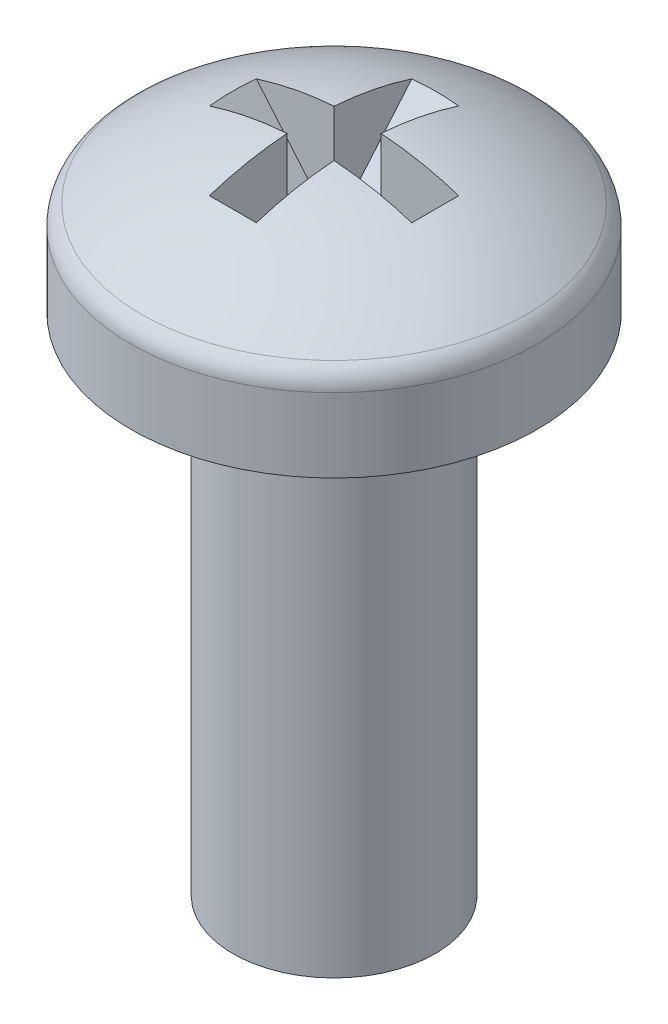
ISO-10303-21;
HEADER;
FILE_DESCRIPTION(('STEP AP214'),'2;1');
FILE_NAME('part.step','',(''),(''),'','','');
FILE_SCHEMA(('AUTOMOTIVE_DESIGN { 1 0 10303 214 1 1 1 1 }'));
ENDSEC;
DATA;
#1=APPLICATION_CONTEXT('core data for automotive mechanical design processes');
#2=APPLICATION_PROTOCOL_DEFINITION('international standard','automotive_design',2000,#1);
#3=PRODUCT_CONTEXT('',#1,'mechanical');
#4=PRODUCT('Part','Part','',(#3));
#5=PRODUCT_RELATED_PRODUCT_CATEGORY('part','',(#4));
#6=PRODUCT_DEFINITION_FORMATION('','',#4);
#7=PRODUCT_DEFINITION_CONTEXT('part definition',#1,'design');
#8=PRODUCT_DEFINITION('design','',#6,#7);
#9=PRODUCT_DEFINITION_SHAPE('','',#8);
#10=(LENGTH_UNIT() NAMED_UNIT(*) SI_UNIT(.MILLI.,.METRE.));
#11=(NAMED_UNIT(*) PLANE_ANGLE_UNIT() SI_UNIT($,.RADIAN.));
#12=(NAMED_UNIT(*) SI_UNIT($,.STERADIAN.) SOLID_ANGLE_UNIT());
#13=UNCERTAINTY_MEASURE_WITH_UNIT(LENGTH_MEASURE(1.E-05),#10,'distance_accuracy_value','');
#14=(GEOMETRIC_REPRESENTATION_CONTEXT(3) GLOBAL_UNCERTAINTY_ASSIGNED_CONTEXT((#13)) GLOBAL_UNIT_ASSIGNED_CONTEXT((#10,
#11,#12)) REPRESENTATION_CONTEXT('',''));
#15=CARTESIAN_POINT('',(0.,0.,0.));
#16=DIRECTION('',(0.,0.,1.));
#17=DIRECTION('',(1.,0.,0.));
#18=AXIS2_PLACEMENT_3D('',#15,#16,#17);
#19=CARTESIAN_POINT('',(0.465,4.65,2.285));
#20=DIRECTION('',(-1.,0.,0.));
#21=DIRECTION('',(0.,0.,1.));
#22=AXIS2_PLACEMENT_3D('',#19,#20,#21);
#23=PLANE('',#22);
#24=DIRECTION('',(0.,0.76333266422502,-0.646005606575619));
#25=VECTOR('',#24,1.);
#26=CARTESIAN_POINT('',(0.465,3.1,-2.285));
#27=LINE('',#26,#25);
#28=CARTESIAN_POINT('',(0.465,0.94945295404814,-0.465));
#29=VERTEX_POINT('',#28);
#30=CARTESIAN_POINT('',(0.465,0.4,0.));
#31=VERTEX_POINT('',#30);
#32=EDGE_CURVE('E255',#29,#31,#27,.F.);
#33=ORIENTED_EDGE('',*,*,#32,.T.);
#34=DIRECTION('',(0.,-0.76333266422502,-0.646005606575619));
#35=VECTOR('',#34,1.);
#36=CARTESIAN_POINT('',(0.465,0.4,0.));
#37=LINE('',#36,#35);
#38=CARTESIAN_POINT('',(0.465,0.94945295404814,0.465));
#39=VERTEX_POINT('',#38);
#40=EDGE_CURVE('E245',#31,#39,#37,.F.);
#41=ORIENTED_EDGE('',*,*,#40,.T.);
#42=DIRECTION('',(0.,0.,1.));
#43=VECTOR('',#42,1.);
#44=CARTESIAN_POINT('',(0.465,0.94945295404814,-0.465));
#45=LINE('',#44,#43);
#46=EDGE_CURVE('E240',#39,#29,#45,.F.);
#47=ORIENTED_EDGE('',*,*,#46,.T.);
#48=EDGE_LOOP('',(#33,#41,#47));
#49=FACE_BOUND('',#48,.T.);
#50=ADVANCED_FACE('F17',(#49),#23,.T.);
#51=CARTESIAN_POINT('',(-2.285,4.65,-0.465));
#52=DIRECTION('',(0.,0.,-1.));
#53=DIRECTION('',(-1.,0.,0.));
#54=AXIS2_PLACEMENT_3D('',#51,#52,#53);
#55=PLANE('',#54);
#56=DIRECTION('',(0.646005606575619,0.76333266422502,0.));
#57=VECTOR('',#56,1.);
#58=CARTESIAN_POINT('',(2.285,3.1,-0.465));
#59=LINE('',#58,#57);
#60=CARTESIAN_POINT('',(2.00334390705982,2.76718973700723,-0.464999999999999));
#61=VERTEX_POINT('',#60);
#62=EDGE_CURVE('E243',#29,#61,#59,.T.);
#63=ORIENTED_EDGE('',*,*,#62,.T.);
#64=CARTESIAN_POINT('',(0.465,3.06675595397475,-0.464999999999998));
#65=CARTESIAN_POINT('',(0.530501324790505,3.06206142493885,-0.464999999999999));
#66=CARTESIAN_POINT('',(0.595931475391858,3.0563742609509,-0.465));
#67=CARTESIAN_POINT('',(0.726411510234753,3.0430395054668,-0.465));
#68=CARTESIAN_POINT('',(0.791461944850671,3.035397299066,-0.465));
#69=CARTESIAN_POINT('',(0.921184381433152,3.01816728890247,-0.465));
#70=CARTESIAN_POINT('',(0.985856856175131,3.00858304450111,-0.465));
#71=CARTESIAN_POINT('',(1.11482464756555,2.98747885600111,-0.465));
#72=CARTESIAN_POINT('',(1.17912025433069,2.97596068477606,-0.465));
#73=CARTESIAN_POINT('',(1.30733536800959,2.95099297996924,-0.465));
#74=CARTESIAN_POINT('',(1.37125487492336,2.93754344638746,-0.465));
#75=CARTESIAN_POINT('',(1.498717934945,2.90871210374989,-0.465));
#76=CARTESIAN_POINT('',(1.56226109172352,2.89332854250361,-0.465));
#77=CARTESIAN_POINT('',(1.68896992101965,2.86062294081929,-0.465));
#78=CARTESIAN_POINT('',(1.75213469616409,2.84329742370304,-0.465));
#79=CARTESIAN_POINT('',(1.8780841234055,2.80669691859744,-0.465));
#80=CARTESIAN_POINT('',(1.9408672649759,2.78741673248598,-0.464999999999999));
#81=CARTESIAN_POINT('',(2.00334390705982,2.76718973700723,-0.464999999999996));
#82=B_SPLINE_CURVE_WITH_KNOTS('',3,(#64,#65,#66,#67,#68,#69,#70,#71,#72,#73,#74,#75,#76,#77,#78,
#79,#80,#81),.UNSPECIFIED.,.F.,.F.,(4,2,2,2,2,2,2,2,4),(0.,0.197000433773616,0.393463972151465,
0.589570637798733,0.7854984999692,0.981426362139666,1.17753302778693,1.37399656616478,
1.5709969999384),.UNSPECIFIED.);
#83=CARTESIAN_POINT('',(0.464999999999999,3.06675595397475,-0.464999999999999));
#84=VERTEX_POINT('',#83);
#85=EDGE_CURVE('E20',#84,#61,#82,.T.);
#86=ORIENTED_EDGE('',*,*,#85,.F.);
#87=DIRECTION('',(0.,1.,0.));
#88=VECTOR('',#87,1.);
#89=CARTESIAN_POINT('',(0.465,4.65,-0.465));
#90=LINE('',#89,#88);
#91=EDGE_CURVE('E237',#29,#84,#90,.T.);
#92=ORIENTED_EDGE('',*,*,#91,.F.);
#93=EDGE_LOOP('',(#63,#86,#92));
#94=FACE_BOUND('',#93,.T.);
#95=ADVANCED_FACE('F568',(#94),#55,.F.);
#96=CARTESIAN_POINT('',(-0.465,3.1,-2.285));
#97=DIRECTION('',(0.,-0.646005606575619,-0.76333266422502));
#98=DIRECTION('',(0.,0.76333266422502,-0.646005606575619));
#99=AXIS2_PLACEMENT_3D('',#96,#97,#98);
#100=PLANE('',#99);
#101=ORIENTED_EDGE('',*,*,#32,.F.);
#102=DIRECTION('',(-0.542627540849774,-0.641179151113519,0.542627540849775));
#103=VECTOR('',#102,1.);
#104=CARTESIAN_POINT('',(0.465,0.94945295404814,-0.465));
#105=LINE('',#104,#103);
#106=CARTESIAN_POINT('',(0.,0.4,0.));
#107=VERTEX_POINT('',#106);
#108=EDGE_CURVE('E230',#29,#107,#105,.T.);
#109=ORIENTED_EDGE('',*,*,#108,.T.);
#110=DIRECTION('',(1.,0.,0.));
#111=VECTOR('',#110,1.);
#112=CARTESIAN_POINT('',(-0.465,0.4,0.));
#113=LINE('',#112,#111);
#114=EDGE_CURVE('E252',#107,#31,#113,.T.);
#115=ORIENTED_EDGE('',*,*,#114,.T.);
#116=EDGE_LOOP('',(#101,#109,#115));
#117=FACE_BOUND('',#116,.T.);
#118=ADVANCED_FACE('F561',(#117),#100,.F.);
#119=CARTESIAN_POINT('',(-0.465,0.4,0.));
#120=DIRECTION('',(0.,-0.646005606575619,0.76333266422502));
#121=DIRECTION('',(0.,-0.76333266422502,-0.646005606575619));
#122=AXIS2_PLACEMENT_3D('',#119,#120,#121);
#123=PLANE('',#122);
#124=ORIENTED_EDGE('',*,*,#114,.F.);
#125=DIRECTION('',(0.542627540849774,0.641179151113519,0.542627540849775));
#126=VECTOR('',#125,1.);
#127=CARTESIAN_POINT('',(0.,0.400000000000001,0.));
#128=LINE('',#127,#126);
#129=EDGE_CURVE('E221',#107,#39,#128,.T.);
#130=ORIENTED_EDGE('',*,*,#129,.T.);
#131=ORIENTED_EDGE('',*,*,#40,.F.);
#132=EDGE_LOOP('',(#124,#130,#131));
#133=FACE_BOUND('',#132,.T.);
#134=ADVANCED_FACE('F368',(#133),#123,.F.);
#135=CARTESIAN_POINT('',(2.285,3.1,-0.465));
#136=DIRECTION('',(0.76333266422502,-0.646005606575619,0.));
#137=DIRECTION('',(0.646005606575619,0.76333266422502,0.));
#138=AXIS2_PLACEMENT_3D('',#135,#136,#137);
#139=PLANE('',#138);
#140=DIRECTION('',(-0.646005606575619,-0.76333266422502,0.));
#141=VECTOR('',#140,1.);
#142=CARTESIAN_POINT('',(2.00334390705982,2.76718973700723,0.465));
#143=LINE('',#142,#141);
#144=CARTESIAN_POINT('',(2.00334390705982,2.76718973700723,0.465));
#145=VERTEX_POINT('',#144);
#146=EDGE_CURVE('E218',#145,#39,#143,.T.);
#147=ORIENTED_EDGE('',*,*,#146,.F.);
#148=CARTESIAN_POINT('',(2.00334390705982,2.76718973700723,-0.465000000000004));
#149=CARTESIAN_POINT('',(2.01106975790789,2.77631875113877,-0.310000000000004));
#150=CARTESIAN_POINT('',(2.01493268333202,2.78088325820448,-0.155000000000003));
#151=CARTESIAN_POINT('',(2.01493268333242,2.78088325820427,0.155000000000005));
#152=CARTESIAN_POINT('',(2.01106975790868,2.77631875113834,0.310000000000011));
#153=CARTESIAN_POINT('',(2.00334390706101,2.76718973700658,0.465000000000019));
#154=B_SPLINE_CURVE_WITH_KNOTS('',3,(#148,#149,#150,#151,#152,#153),.UNSPECIFIED.,.F.,.F.,(4,2,
4),(0.,0.465345906029345,0.930691812058695),.UNSPECIFIED.);
#155=EDGE_CURVE('E86',#61,#145,#154,.T.);
#156=ORIENTED_EDGE('',*,*,#155,.F.);
#157=ORIENTED_EDGE('',*,*,#62,.F.);
#158=ORIENTED_EDGE('',*,*,#46,.F.);
#159=EDGE_LOOP('',(#147,#156,#157,#158));
#160=FACE_BOUND('',#159,.T.);
#161=ADVANCED_FACE('F363',(#160),#139,.F.);
#162=CARTESIAN_POINT('',(0.465,4.65,2.285));
#163=DIRECTION('',(-1.,0.,0.));
#164=DIRECTION('',(0.,0.,1.));
#165=AXIS2_PLACEMENT_3D('',#162,#163,#164);
#166=PLANE('',#165);
#167=ORIENTED_EDGE('',*,*,#91,.T.);
#168=CARTESIAN_POINT('',(0.464999999999999,-3.42079422382671,0.));
#169=DIRECTION('',(1.,0.,0.));
#170=DIRECTION('',(0.,0.,-1.));
#171=AXIS2_PLACEMENT_3D('',#168,#169,#170);
#172=CIRCLE('',#171,6.50419344034999);
#173=CARTESIAN_POINT('',(0.464999999999999,2.76718973700723,-2.00334390705982));
#174=VERTEX_POINT('',#173);
#175=EDGE_CURVE('E234',#84,#174,#172,.F.);
#176=ORIENTED_EDGE('',*,*,#175,.T.);
#177=DIRECTION('',(0.,0.76333266422502,-0.646005606575619));
#178=VECTOR('',#177,1.);
#179=CARTESIAN_POINT('',(0.465,3.1,-2.285));
#180=LINE('',#179,#178);
#181=EDGE_CURVE('E209',#174,#29,#180,.F.);
#182=ORIENTED_EDGE('',*,*,#181,.T.);
#183=EDGE_LOOP('',(#167,#176,#182));
#184=FACE_BOUND('',#183,.T.);
#185=ADVANCED_FACE('F359',(#184),#166,.T.);
#186=CARTESIAN_POINT('',(2.285,3.1,-0.465));
#187=DIRECTION('',(0.76333266422502,-0.646005606575619,0.));
#188=DIRECTION('',(0.646005606575619,0.76333266422502,0.));
#189=AXIS2_PLACEMENT_3D('',#186,#187,#188);
#190=PLANE('',#189);
#191=ORIENTED_EDGE('',*,*,#108,.F.);
#192=DIRECTION('',(-0.646005606575619,-0.76333266422502,0.));
#193=VECTOR('',#192,1.);
#194=CARTESIAN_POINT('',(0.465,0.94945295404814,-0.465));
#195=LINE('',#194,#193);
#196=CARTESIAN_POINT('',(0.,0.4,-0.465));
#197=VERTEX_POINT('',#196);
#198=EDGE_CURVE('E226',#29,#197,#195,.T.);
#199=ORIENTED_EDGE('',*,*,#198,.T.);
#200=DIRECTION('',(0.,0.,1.));
#201=VECTOR('',#200,1.);
#202=CARTESIAN_POINT('',(0.,0.4,-0.465));
#203=LINE('',#202,#201);
#204=EDGE_CURVE('E201',#197,#107,#203,.T.);
#205=ORIENTED_EDGE('',*,*,#204,.T.);
#206=EDGE_LOOP('',(#191,#199,#205));
#207=FACE_BOUND('',#206,.T.);
#208=ADVANCED_FACE('F355',(#207),#190,.F.);
#209=CARTESIAN_POINT('',(-2.285,4.65,-0.465));
#210=DIRECTION('',(0.,0.,-1.));
#211=DIRECTION('',(-1.,0.,0.));
#212=AXIS2_PLACEMENT_3D('',#209,#210,#211);
#213=PLANE('',#212);
#214=DIRECTION('',(1.,0.,0.));
#215=VECTOR('',#214,1.);
#216=CARTESIAN_POINT('',(-0.465,0.94945295404814,-0.465));
#217=LINE('',#216,#215);
#218=CARTESIAN_POINT('',(-0.465,0.94945295404814,-0.465));
#219=VERTEX_POINT('',#218);
#220=EDGE_CURVE('E93',#29,#219,#217,.F.);
#221=ORIENTED_EDGE('',*,*,#220,.T.);
#222=DIRECTION('',(0.646005606575619,-0.76333266422502,0.));
#223=VECTOR('',#222,1.);
#224=CARTESIAN_POINT('',(0.,0.4,-0.465));
#225=LINE('',#224,#223);
#226=EDGE_CURVE('E196',#219,#197,#225,.T.);
#227=ORIENTED_EDGE('',*,*,#226,.T.);
#228=ORIENTED_EDGE('',*,*,#198,.F.);
#229=EDGE_LOOP('',(#221,#227,#228));
#230=FACE_BOUND('',#229,.T.);
#231=ADVANCED_FACE('F351',(#230),#213,.F.);
#232=CARTESIAN_POINT('',(2.285,3.1,-0.465));
#233=DIRECTION('',(0.76333266422502,-0.646005606575619,0.));
#234=DIRECTION('',(0.646005606575619,0.76333266422502,0.));
#235=AXIS2_PLACEMENT_3D('',#232,#233,#234);
#236=PLANE('',#235);
#237=ORIENTED_EDGE('',*,*,#129,.F.);
#238=DIRECTION('',(0.,0.,1.));
#239=VECTOR('',#238,1.);
#240=CARTESIAN_POINT('',(0.,0.4,-0.465));
#241=LINE('',#240,#239);
#242=CARTESIAN_POINT('',(0.,0.4,0.465));
#243=VERTEX_POINT('',#242);
#244=EDGE_CURVE('E192',#107,#243,#241,.T.);
#245=ORIENTED_EDGE('',*,*,#244,.T.);
#246=DIRECTION('',(-0.646005606575619,-0.76333266422502,0.));
#247=VECTOR('',#246,1.);
#248=CARTESIAN_POINT('',(0.465,0.94945295404814,0.465));
#249=LINE('',#248,#247);
#250=EDGE_CURVE('E187',#39,#243,#249,.T.);
#251=ORIENTED_EDGE('',*,*,#250,.F.);
#252=EDGE_LOOP('',(#237,#245,#251));
#253=FACE_BOUND('',#252,.T.);
#254=ADVANCED_FACE('F347',(#253),#236,.F.);
#255=CARTESIAN_POINT('',(-2.285,4.65,0.465));
#256=DIRECTION('',(0.,0.,-1.));
#257=DIRECTION('',(-1.,0.,0.));
#258=AXIS2_PLACEMENT_3D('',#255,#256,#257);
#259=PLANE('',#258);
#260=DIRECTION('',(0.,1.,0.));
#261=VECTOR('',#260,1.);
#262=CARTESIAN_POINT('',(0.465,4.65,0.465));
#263=LINE('',#262,#261);
#264=CARTESIAN_POINT('',(0.464999999999999,3.06675595397475,0.465));
#265=VERTEX_POINT('',#264);
#266=EDGE_CURVE('E179',#265,#39,#263,.F.);
#267=ORIENTED_EDGE('',*,*,#266,.F.);
#268=CARTESIAN_POINT('',(0.465,3.06675595397475,0.465));
#269=CARTESIAN_POINT('',(0.530501324790505,3.06206142493885,0.465));
#270=CARTESIAN_POINT('',(0.595931475391859,3.0563742609509,0.465));
#271=CARTESIAN_POINT('',(0.726411510234753,3.0430395054668,0.465));
#272=CARTESIAN_POINT('',(0.791461944850671,3.035397299066,0.465));
#273=CARTESIAN_POINT('',(0.921184381433152,3.01816728890247,0.465));
#274=CARTESIAN_POINT('',(0.985856856175132,3.00858304450111,0.465));
#275=CARTESIAN_POINT('',(1.11482464756555,2.98747885600111,0.465));
#276=CARTESIAN_POINT('',(1.17912025433069,2.97596068477606,0.465));
#277=CARTESIAN_POINT('',(1.30733536800959,2.95099297996924,0.465));
#278=CARTESIAN_POINT('',(1.37125487492336,2.93754344638746,0.465));
#279=CARTESIAN_POINT('',(1.498717934945,2.90871210374989,0.465));
#280=CARTESIAN_POINT('',(1.56226109172352,2.89332854250361,0.465));
#281=CARTESIAN_POINT('',(1.68896992101965,2.86062294081929,0.465));
#282=CARTESIAN_POINT('',(1.75213469616409,2.84329742370304,0.465));
#283=CARTESIAN_POINT('',(1.8780841234055,2.80669691859744,0.465));
#284=CARTESIAN_POINT('',(1.9408672649759,2.78741673248598,0.465));
#285=CARTESIAN_POINT('',(2.00334390705982,2.76718973700723,0.465));
#286=B_SPLINE_CURVE_WITH_KNOTS('',3,(#268,#269,#270,#271,#272,#273,#274,#275,#276,#277,#278,
#279,#280,#281,#282,#283,#284,#285),.UNSPECIFIED.,.F.,.F.,(4,2,2,2,2,2,2,2,4),(0.,
0.197000433773616,0.393463972151465,0.589570637798734,0.7854984999692,0.981426362139666,
1.17753302778693,1.37399656616478,1.5709969999384),.UNSPECIFIED.);
#287=EDGE_CURVE('E212',#265,#145,#286,.T.);
#288=ORIENTED_EDGE('',*,*,#287,.T.);
#289=ORIENTED_EDGE('',*,*,#146,.T.);
#290=EDGE_LOOP('',(#267,#288,#289));
#291=FACE_BOUND('',#290,.T.);
#292=ADVANCED_FACE('F342',(#291),#259,.T.);
#293=CARTESIAN_POINT('',(-0.465,3.1,-2.285));
#294=DIRECTION('',(0.,-0.646005606575619,-0.76333266422502));
#295=DIRECTION('',(0.,0.76333266422502,-0.646005606575619));
#296=AXIS2_PLACEMENT_3D('',#293,#294,#295);
#297=PLANE('',#296);
#298=DIRECTION('',(0.,-0.76333266422502,0.646005606575619));
#299=VECTOR('',#298,1.);
#300=CARTESIAN_POINT('',(-0.465,2.76718973700723,-2.00334390705982));
#301=LINE('',#300,#299);
#302=CARTESIAN_POINT('',(-0.465,2.76718973700723,-2.00334390705982));
#303=VERTEX_POINT('',#302);
#304=EDGE_CURVE('E174',#303,#219,#301,.T.);
#305=ORIENTED_EDGE('',*,*,#304,.T.);
#306=ORIENTED_EDGE('',*,*,#220,.F.);
#307=ORIENTED_EDGE('',*,*,#181,.F.);
#308=CARTESIAN_POINT('',(-0.465,2.76718973700723,-2.00334390705982));
#309=CARTESIAN_POINT('',(-0.31,2.77631875113875,-2.01106975790816));
#310=CARTESIAN_POINT('',(-0.155,2.78088325820451,-2.01493268333233));
#311=CARTESIAN_POINT('',(0.155,2.78088325820451,-2.01493268333233));
#312=CARTESIAN_POINT('',(0.31,2.77631875113875,-2.01106975790816));
#313=CARTESIAN_POINT('',(0.465,2.76718973700723,-2.00334390705982));
#314=B_SPLINE_CURVE_WITH_KNOTS('',3,(#308,#309,#310,#311,#312,#313),.UNSPECIFIED.,.F.,.F.,(4,2,
4),(0.,0.465345906029348,0.930691812058696),.UNSPECIFIED.);
#315=EDGE_CURVE('E206',#303,#174,#314,.T.);
#316=ORIENTED_EDGE('',*,*,#315,.F.);
#317=EDGE_LOOP('',(#305,#306,#307,#316));
#318=FACE_BOUND('',#317,.T.);
#319=ADVANCED_FACE('F337',(#318),#297,.F.);
#320=CARTESIAN_POINT('',(0.,0.4,-0.465));
#321=DIRECTION('',(-0.76333266422502,-0.646005606575619,0.));
#322=DIRECTION('',(0.646005606575619,-0.76333266422502,0.));
#323=AXIS2_PLACEMENT_3D('',#320,#321,#322);
#324=PLANE('',#323);
#325=DIRECTION('',(0.542627540849775,-0.641179151113519,0.542627540849774));
#326=VECTOR('',#325,1.);
#327=CARTESIAN_POINT('',(-0.465,0.949452954048141,-0.465));
#328=LINE('',#327,#326);
#329=EDGE_CURVE('E120',#219,#107,#328,.T.);
#330=ORIENTED_EDGE('',*,*,#329,.T.);
#331=ORIENTED_EDGE('',*,*,#204,.F.);
#332=ORIENTED_EDGE('',*,*,#226,.F.);
#333=EDGE_LOOP('',(#330,#331,#332));
#334=FACE_BOUND('',#333,.T.);
#335=ADVANCED_FACE('F341',(#334),#324,.F.);
#336=CARTESIAN_POINT('',(0.,0.4,-0.465));
#337=DIRECTION('',(-0.76333266422502,-0.646005606575619,0.));
#338=DIRECTION('',(0.646005606575619,-0.76333266422502,0.));
#339=AXIS2_PLACEMENT_3D('',#336,#337,#338);
#340=PLANE('',#339);
#341=DIRECTION('',(-0.542627540849774,0.641179151113519,0.542627540849774));
#342=VECTOR('',#341,1.);
#343=CARTESIAN_POINT('',(0.,0.4,0.));
#344=LINE('',#343,#342);
#345=CARTESIAN_POINT('',(-0.465,0.94945295404814,0.465));
#346=VERTEX_POINT('',#345);
#347=EDGE_CURVE('E133',#107,#346,#344,.T.);
#348=ORIENTED_EDGE('',*,*,#347,.T.);
#349=DIRECTION('',(-0.646005606575619,0.76333266422502,0.));
#350=VECTOR('',#349,1.);
#351=CARTESIAN_POINT('',(0.,0.4,0.465));
#352=LINE('',#351,#350);
#353=EDGE_CURVE('E182',#243,#346,#352,.T.);
#354=ORIENTED_EDGE('',*,*,#353,.F.);
#355=ORIENTED_EDGE('',*,*,#244,.F.);
#356=EDGE_LOOP('',(#348,#354,#355));
#357=FACE_BOUND('',#356,.T.);
#358=ADVANCED_FACE('F514',(#357),#340,.F.);
#359=CARTESIAN_POINT('',(-2.285,4.65,0.465));
#360=DIRECTION('',(0.,0.,-1.));
#361=DIRECTION('',(-1.,0.,0.));
#362=AXIS2_PLACEMENT_3D('',#359,#360,#361);
#363=PLANE('',#362);
#364=ORIENTED_EDGE('',*,*,#250,.T.);
#365=ORIENTED_EDGE('',*,*,#353,.T.);
#366=DIRECTION('',(1.,0.,0.));
#367=VECTOR('',#366,1.);
#368=CARTESIAN_POINT('',(-0.465,0.94945295404814,0.465));
#369=LINE('',#368,#367);
#370=EDGE_CURVE('E134',#346,#39,#369,.T.);
#371=ORIENTED_EDGE('',*,*,#370,.T.);
#372=EDGE_LOOP('',(#364,#365,#371));
#373=FACE_BOUND('',#372,.T.);
#374=ADVANCED_FACE('F506',(#373),#363,.T.);
#375=CARTESIAN_POINT('',(0.465,4.65,2.285));
#376=DIRECTION('',(-1.,0.,0.));
#377=DIRECTION('',(0.,0.,1.));
#378=AXIS2_PLACEMENT_3D('',#375,#376,#377);
#379=PLANE('',#378);
#380=DIRECTION('',(0.,-0.76333266422502,-0.646005606575619));
#381=VECTOR('',#380,1.);
#382=CARTESIAN_POINT('',(0.465,0.4,0.));
#383=LINE('',#382,#381);
#384=CARTESIAN_POINT('',(0.465,2.76718973700723,2.00334390705982));
#385=VERTEX_POINT('',#384);
#386=EDGE_CURVE('E155',#39,#385,#383,.F.);
#387=ORIENTED_EDGE('',*,*,#386,.T.);
#388=CARTESIAN_POINT('',(0.464999999999999,-3.42079422382671,0.));
#389=DIRECTION('',(1.,0.,0.));
#390=DIRECTION('',(0.,0.,-1.));
#391=AXIS2_PLACEMENT_3D('',#388,#389,#390);
#392=CIRCLE('',#391,6.50419344034999);
#393=EDGE_CURVE('E176',#385,#265,#392,.F.);
#394=ORIENTED_EDGE('',*,*,#393,.T.);
#395=ORIENTED_EDGE('',*,*,#266,.T.);
#396=EDGE_LOOP('',(#387,#394,#395));
#397=FACE_BOUND('',#396,.T.);
#398=ADVANCED_FACE('F499',(#397),#379,.T.);
#399=CARTESIAN_POINT('',(-0.465,4.65,2.285));
#400=DIRECTION('',(-1.,0.,0.));
#401=DIRECTION('',(0.,0.,1.));
#402=AXIS2_PLACEMENT_3D('',#399,#400,#401);
#403=PLANE('',#402);
#404=DIRECTION('',(0.,1.,0.));
#405=VECTOR('',#404,1.);
#406=CARTESIAN_POINT('',(-0.465,4.65,-0.465));
#407=LINE('',#406,#405);
#408=CARTESIAN_POINT('',(-0.465,3.06675595397475,-0.464999999999999));
#409=VERTEX_POINT('',#408);
#410=EDGE_CURVE('E127',#409,#219,#407,.F.);
#411=ORIENTED_EDGE('',*,*,#410,.T.);
#412=ORIENTED_EDGE('',*,*,#304,.F.);
#413=CARTESIAN_POINT('',(-0.465000000000001,-3.42079422382671,0.));
#414=DIRECTION('',(1.,0.,0.));
#415=DIRECTION('',(0.,0.,-1.));
#416=AXIS2_PLACEMENT_3D('',#413,#414,#415);
#417=CIRCLE('',#416,6.50419344034999);
#418=EDGE_CURVE('E171',#409,#303,#417,.F.);
#419=ORIENTED_EDGE('',*,*,#418,.F.);
#420=EDGE_LOOP('',(#411,#412,#419));
#421=FACE_BOUND('',#420,.T.);
#422=ADVANCED_FACE('F383',(#421),#403,.F.);
#423=CARTESIAN_POINT('',(-0.465,3.1,-2.285));
#424=DIRECTION('',(0.,-0.646005606575619,-0.76333266422502));
#425=DIRECTION('',(0.,0.76333266422502,-0.646005606575619));
#426=AXIS2_PLACEMENT_3D('',#423,#424,#425);
#427=PLANE('',#426);
#428=DIRECTION('',(1.,0.,0.));
#429=VECTOR('',#428,1.);
#430=CARTESIAN_POINT('',(-0.465,0.4,0.));
#431=LINE('',#430,#429);
#432=CARTESIAN_POINT('',(-0.465,0.4,0.));
#433=VERTEX_POINT('',#432);
#434=EDGE_CURVE('E117',#433,#107,#431,.T.);
#435=ORIENTED_EDGE('',*,*,#434,.T.);
#436=ORIENTED_EDGE('',*,*,#329,.F.);
#437=DIRECTION('',(0.,-0.76333266422502,0.646005606575619));
#438=VECTOR('',#437,1.);
#439=CARTESIAN_POINT('',(-0.465,0.94945295404814,-0.465));
#440=LINE('',#439,#438);
#441=EDGE_CURVE('E114',#219,#433,#440,.T.);
#442=ORIENTED_EDGE('',*,*,#441,.T.);
#443=EDGE_LOOP('',(#435,#436,#442));
#444=FACE_BOUND('',#443,.T.);
#445=ADVANCED_FACE('F116',(#444),#427,.F.);
#446=CARTESIAN_POINT('',(-0.465,0.4,0.));
#447=DIRECTION('',(0.,-0.646005606575619,0.76333266422502));
#448=DIRECTION('',(0.,-0.76333266422502,-0.646005606575619));
#449=AXIS2_PLACEMENT_3D('',#446,#447,#448);
#450=PLANE('',#449);
#451=DIRECTION('',(0.,0.76333266422502,0.646005606575619));
#452=VECTOR('',#451,1.);
#453=CARTESIAN_POINT('',(-0.465,0.4,0.));
#454=LINE('',#453,#452);
#455=EDGE_CURVE('E126',#433,#346,#454,.T.);
#456=ORIENTED_EDGE('',*,*,#455,.T.);
#457=ORIENTED_EDGE('',*,*,#347,.F.);
#458=ORIENTED_EDGE('',*,*,#434,.F.);
#459=EDGE_LOOP('',(#456,#457,#458));
#460=FACE_BOUND('',#459,.T.);
#461=ADVANCED_FACE('F131',(#460),#450,.F.);
#462=CARTESIAN_POINT('',(-0.465,0.4,0.));
#463=DIRECTION('',(0.,-0.646005606575619,0.76333266422502));
#464=DIRECTION('',(0.,-0.76333266422502,-0.646005606575619));
#465=AXIS2_PLACEMENT_3D('',#462,#463,#464);
#466=PLANE('',#465);
#467=ORIENTED_EDGE('',*,*,#386,.F.);
#468=ORIENTED_EDGE('',*,*,#370,.F.);
#469=DIRECTION('',(0.,0.76333266422502,0.646005606575619));
#470=VECTOR('',#469,1.);
#471=CARTESIAN_POINT('',(-0.465,0.94945295404814,0.465));
#472=LINE('',#471,#470);
#473=CARTESIAN_POINT('',(-0.465,2.76718973700723,2.00334390705982));
#474=VERTEX_POINT('',#473);
#475=EDGE_CURVE('E139',#346,#474,#472,.T.);
#476=ORIENTED_EDGE('',*,*,#475,.T.);
#477=CARTESIAN_POINT('',(0.465,2.76718973700723,2.00334390705982));
#478=CARTESIAN_POINT('',(0.31,2.77631875113875,2.01106975790816));
#479=CARTESIAN_POINT('',(0.155,2.78088325820451,2.01493268333233));
#480=CARTESIAN_POINT('',(-0.155,2.78088325820451,2.01493268333233));
#481=CARTESIAN_POINT('',(-0.31,2.77631875113875,2.01106975790816));
#482=CARTESIAN_POINT('',(-0.465,2.76718973700723,2.00334390705982));
#483=B_SPLINE_CURVE_WITH_KNOTS('',3,(#477,#478,#479,#480,#481,#482),.UNSPECIFIED.,.F.,.F.,(4,2,
4),(0.,0.465345906029348,0.930691812058696),.UNSPECIFIED.);
#484=EDGE_CURVE('E158',#385,#474,#483,.T.);
#485=ORIENTED_EDGE('',*,*,#484,.F.);
#486=EDGE_LOOP('',(#467,#468,#476,#485));
#487=FACE_BOUND('',#486,.T.);
#488=ADVANCED_FACE('F309',(#487),#466,.F.);
#489=CARTESIAN_POINT('',(-2.285,4.65,-0.465));
#490=DIRECTION('',(0.,0.,-1.));
#491=DIRECTION('',(-1.,0.,0.));
#492=AXIS2_PLACEMENT_3D('',#489,#490,#491);
#493=PLANE('',#492);
#494=ORIENTED_EDGE('',*,*,#410,.F.);
#495=CARTESIAN_POINT('',(-2.00334390705982,2.76718973700723,-0.464999999999997));
#496=CARTESIAN_POINT('',(-1.9408672649759,2.78741673248598,-0.464999999999999));
#497=CARTESIAN_POINT('',(-1.8780841234055,2.80669691859744,-0.465));
#498=CARTESIAN_POINT('',(-1.75213469616409,2.84329742370304,-0.465));
#499=CARTESIAN_POINT('',(-1.68896992101966,2.86062294081929,-0.465));
#500=CARTESIAN_POINT('',(-1.56226109172352,2.89332854250361,-0.465));
#501=CARTESIAN_POINT('',(-1.498717934945,2.90871210374988,-0.465));
#502=CARTESIAN_POINT('',(-1.37125487492336,2.93754344638746,-0.465));
#503=CARTESIAN_POINT('',(-1.30733536800959,2.95099297996924,-0.465));
#504=CARTESIAN_POINT('',(-1.17912025433069,2.97596068477606,-0.465));
#505=CARTESIAN_POINT('',(-1.11482464756555,2.98747885600111,-0.465));
#506=CARTESIAN_POINT('',(-0.985856856175132,3.00858304450111,-0.465));
#507=CARTESIAN_POINT('',(-0.921184381433153,3.01816728890247,-0.465));
#508=CARTESIAN_POINT('',(-0.791461944850672,3.035397299066,-0.465));
#509=CARTESIAN_POINT('',(-0.726411510234753,3.0430395054668,-0.465));
#510=CARTESIAN_POINT('',(-0.595931475391859,3.0563742609509,-0.465));
#511=CARTESIAN_POINT('',(-0.530501324790506,3.06206142493885,-0.464999999999999));
#512=CARTESIAN_POINT('',(-0.465,3.06675595397475,-0.464999999999998));
#513=B_SPLINE_CURVE_WITH_KNOTS('',3,(#495,#496,#497,#498,#499,#500,#501,#502,#503,#504,#505,
#506,#507,#508,#509,#510,#511,#512),.UNSPECIFIED.,.F.,.F.,(4,2,2,2,2,2,2,2,4),(0.,
0.197000433773616,0.393463972151465,0.589570637798734,0.7854984999692,0.981426362139665,
1.17753302778693,1.37399656616478,1.5709969999384),.UNSPECIFIED.);
#514=CARTESIAN_POINT('',(-2.00334390705982,2.76718973700723,-0.465));
#515=VERTEX_POINT('',#514);
#516=EDGE_CURVE('E152',#515,#409,#513,.T.);
#517=ORIENTED_EDGE('',*,*,#516,.F.);
#518=DIRECTION('',(0.646005606575619,-0.76333266422502,0.));
#519=VECTOR('',#518,1.);
#520=CARTESIAN_POINT('',(0.,0.4,-0.465));
#521=LINE('',#520,#519);
#522=EDGE_CURVE('E386',#515,#219,#521,.T.);
#523=ORIENTED_EDGE('',*,*,#522,.T.);
#524=EDGE_LOOP('',(#494,#517,#523));
#525=FACE_BOUND('',#524,.T.);
#526=ADVANCED_FACE('F305',(#525),#493,.F.);
#527=CARTESIAN_POINT('',(-0.465,4.65,2.285));
#528=DIRECTION('',(-1.,0.,0.));
#529=DIRECTION('',(0.,0.,1.));
#530=AXIS2_PLACEMENT_3D('',#527,#528,#529);
#531=PLANE('',#530);
#532=ORIENTED_EDGE('',*,*,#441,.F.);
#533=DIRECTION('',(0.,0.,1.));
#534=VECTOR('',#533,1.);
#535=CARTESIAN_POINT('',(-0.465,0.94945295404814,-0.465));
#536=LINE('',#535,#534);
#537=EDGE_CURVE('E137',#219,#346,#536,.T.);
#538=ORIENTED_EDGE('',*,*,#537,.T.);
#539=ORIENTED_EDGE('',*,*,#455,.F.);
#540=EDGE_LOOP('',(#532,#538,#539));
#541=FACE_BOUND('',#540,.T.);
#542=ADVANCED_FACE('F136',(#541),#531,.F.);
#543=CARTESIAN_POINT('',(-0.465,4.65,2.285));
#544=DIRECTION('',(-1.,0.,0.));
#545=DIRECTION('',(0.,0.,1.));
#546=AXIS2_PLACEMENT_3D('',#543,#544,#545);
#547=PLANE('',#546);
#548=ORIENTED_EDGE('',*,*,#475,.F.);
#549=DIRECTION('',(0.,1.,0.));
#550=VECTOR('',#549,1.);
#551=CARTESIAN_POINT('',(-0.465,4.65,0.465));
#552=LINE('',#551,#550);
#553=CARTESIAN_POINT('',(-0.465,3.06675595397475,0.465));
#554=VERTEX_POINT('',#553);
#555=EDGE_CURVE('E388',#554,#346,#552,.F.);
#556=ORIENTED_EDGE('',*,*,#555,.F.);
#557=CARTESIAN_POINT('',(-0.465000000000001,-3.42079422382671,0.));
#558=DIRECTION('',(1.,0.,0.));
#559=DIRECTION('',(0.,0.,-1.));
#560=AXIS2_PLACEMENT_3D('',#557,#558,#559);
#561=CIRCLE('',#560,6.50419344034999);
#562=EDGE_CURVE('E39',#474,#554,#561,.F.);
#563=ORIENTED_EDGE('',*,*,#562,.F.);
#564=EDGE_LOOP('',(#548,#556,#563));
#565=FACE_BOUND('',#564,.T.);
#566=ADVANCED_FACE('F298',(#565),#547,.F.);
#567=CARTESIAN_POINT('',(0.,0.4,-0.465));
#568=DIRECTION('',(-0.76333266422502,-0.646005606575619,0.));
#569=DIRECTION('',(0.646005606575619,-0.76333266422502,0.));
#570=AXIS2_PLACEMENT_3D('',#567,#568,#569);
#571=PLANE('',#570);
#572=ORIENTED_EDGE('',*,*,#537,.F.);
#573=ORIENTED_EDGE('',*,*,#522,.F.);
#574=CARTESIAN_POINT('',(-2.00334390705982,2.76718973700723,0.465));
#575=CARTESIAN_POINT('',(-2.01106975790789,2.77631875113877,0.310000000000002));
#576=CARTESIAN_POINT('',(-2.01493268333202,2.78088325820448,0.155000000000002));
#577=CARTESIAN_POINT('',(-2.01493268333242,2.78088325820427,-0.155000000000007));
#578=CARTESIAN_POINT('',(-2.01106975790868,2.77631875113833,-0.310000000000015));
#579=CARTESIAN_POINT('',(-2.00334390706101,2.76718973700658,-0.465000000000026));
#580=B_SPLINE_CURVE_WITH_KNOTS('',3,(#574,#575,#576,#577,#578,#579),.UNSPECIFIED.,.F.,.F.,(4,2,
4),(0.,0.465345906029341,0.930691812058697),.UNSPECIFIED.);
#581=CARTESIAN_POINT('',(-2.00334390705982,2.76718973700723,0.465));
#582=VERTEX_POINT('',#581);
#583=EDGE_CURVE('E280',#582,#515,#580,.T.);
#584=ORIENTED_EDGE('',*,*,#583,.F.);
#585=DIRECTION('',(-0.646005606575619,0.76333266422502,0.));
#586=VECTOR('',#585,1.);
#587=CARTESIAN_POINT('',(-0.465,0.94945295404814,0.465));
#588=LINE('',#587,#586);
#589=EDGE_CURVE('E279',#346,#582,#588,.T.);
#590=ORIENTED_EDGE('',*,*,#589,.F.);
#591=EDGE_LOOP('',(#572,#573,#584,#590));
#592=FACE_BOUND('',#591,.T.);
#593=ADVANCED_FACE('F293',(#592),#571,.F.);
#594=CARTESIAN_POINT('',(-2.285,4.65,0.465));
#595=DIRECTION('',(0.,0.,-1.));
#596=DIRECTION('',(-1.,0.,0.));
#597=AXIS2_PLACEMENT_3D('',#594,#595,#596);
#598=PLANE('',#597);
#599=ORIENTED_EDGE('',*,*,#589,.T.);
#600=CARTESIAN_POINT('',(-0.465,3.06675595397475,0.465));
#601=CARTESIAN_POINT('',(-0.530501324790506,3.06206142493885,0.465));
#602=CARTESIAN_POINT('',(-0.595931475391859,3.0563742609509,0.465));
#603=CARTESIAN_POINT('',(-0.726411510234753,3.0430395054668,0.465));
#604=CARTESIAN_POINT('',(-0.791461944850672,3.035397299066,0.465));
#605=CARTESIAN_POINT('',(-0.921184381433153,3.01816728890247,0.465));
#606=CARTESIAN_POINT('',(-0.985856856175132,3.00858304450111,0.465));
#607=CARTESIAN_POINT('',(-1.11482464756555,2.98747885600111,0.465));
#608=CARTESIAN_POINT('',(-1.17912025433069,2.97596068477606,0.465));
#609=CARTESIAN_POINT('',(-1.30733536800959,2.95099297996924,0.465));
#610=CARTESIAN_POINT('',(-1.37125487492336,2.93754344638746,0.465));
#611=CARTESIAN_POINT('',(-1.498717934945,2.90871210374988,0.465));
#612=CARTESIAN_POINT('',(-1.56226109172352,2.89332854250361,0.465));
#613=CARTESIAN_POINT('',(-1.68896992101966,2.86062294081929,0.465));
#614=CARTESIAN_POINT('',(-1.75213469616409,2.84329742370304,0.465));
#615=CARTESIAN_POINT('',(-1.8780841234055,2.80669691859744,0.465));
#616=CARTESIAN_POINT('',(-1.9408672649759,2.78741673248598,0.465));
#617=CARTESIAN_POINT('',(-2.00334390705982,2.76718973700723,0.465));
#618=B_SPLINE_CURVE_WITH_KNOTS('',3,(#600,#601,#602,#603,#604,#605,#606,#607,#608,#609,#610,
#611,#612,#613,#614,#615,#616,#617),.UNSPECIFIED.,.F.,.F.,(4,2,2,2,2,2,2,2,4),(0.,
0.197000433773616,0.393463972151465,0.589570637798734,0.7854984999692,0.981426362139666,
1.17753302778693,1.37399656616478,1.5709969999384),.UNSPECIFIED.);
#619=EDGE_CURVE('E273',#554,#582,#618,.T.);
#620=ORIENTED_EDGE('',*,*,#619,.F.);
#621=ORIENTED_EDGE('',*,*,#555,.T.);
#622=EDGE_LOOP('',(#599,#620,#621));
#623=FACE_BOUND('',#622,.T.);
#624=ADVANCED_FACE('F290',(#623),#598,.T.);
#625=CARTESIAN_POINT('',(0.,-3.42079422382671,0.));
#626=DIRECTION('',(1.,0.,0.));
#627=DIRECTION('',(0.,1.,0.));
#628=AXIS2_PLACEMENT_3D('',#625,#626,#627);
#629=SPHERICAL_SURFACE('',#628,6.52079422382672);
#630=ORIENTED_EDGE('',*,*,#619,.T.);
#631=ORIENTED_EDGE('',*,*,#583,.T.);
#632=ORIENTED_EDGE('',*,*,#516,.T.);
#633=ORIENTED_EDGE('',*,*,#418,.T.);
#634=ORIENTED_EDGE('',*,*,#315,.T.);
#635=ORIENTED_EDGE('',*,*,#175,.F.);
#636=ORIENTED_EDGE('',*,*,#85,.T.);
#637=ORIENTED_EDGE('',*,*,#155,.T.);
#638=ORIENTED_EDGE('',*,*,#287,.F.);
#639=ORIENTED_EDGE('',*,*,#393,.F.);
#640=ORIENTED_EDGE('',*,*,#484,.T.);
#641=ORIENTED_EDGE('',*,*,#562,.T.);
#642=EDGE_LOOP('',(#630,#631,#632,#633,#634,#635,#636,#637,#638,#639,#640,#641));
#643=FACE_BOUND('',#642,.T.);
#644=CARTESIAN_POINT('',(0.,1.86911471207486,0.));
#645=DIRECTION('',(0.,-1.,0.));
#646=DIRECTION('',(0.,0.,-1.));
#647=AXIS2_PLACEMENT_3D('',#644,#645,#646);
#648=CIRCLE('',#647,3.81282320064286);
#649=CARTESIAN_POINT('',(0.,1.86911471207486,-3.81282320064286));
#650=VERTEX_POINT('',#649);
#651=EDGE_CURVE('E270',#650,#650,#648,.T.);
#652=ORIENTED_EDGE('',*,*,#651,.F.);
#653=EDGE_LOOP('',(#652));
#654=FACE_BOUND('',#653,.T.);
#655=ADVANCED_FACE('F286',(#643,#654),#629,.T.);
#656=CARTESIAN_POINT('',(0.,1.4628519550032,0.));
#657=DIRECTION('',(0.,-1.,0.));
#658=DIRECTION('',(0.,0.,-1.));
#659=AXIS2_PLACEMENT_3D('',#656,#657,#658);
#660=TOROIDAL_SURFACE('',#659,3.52,0.500794223826715);
#661=ORIENTED_EDGE('',*,*,#651,.T.);
#662=EDGE_LOOP('',(#661));
#663=FACE_BOUND('',#662,.T.);
#664=CARTESIAN_POINT('',(0.,1.4628519550032,0.));
#665=DIRECTION('',(0.,-1.,0.));
#666=DIRECTION('',(0.,0.,-1.));
#667=AXIS2_PLACEMENT_3D('',#664,#665,#666);
#668=CIRCLE('',#667,4.02079422382672);
#669=CARTESIAN_POINT('',(0.,1.4628519550032,-4.02079422382672));
#670=VERTEX_POINT('',#669);
#671=EDGE_CURVE('E269',#670,#670,#668,.T.);
#672=ORIENTED_EDGE('',*,*,#671,.F.);
#673=EDGE_LOOP('',(#672));
#674=FACE_BOUND('',#673,.T.);
#675=ADVANCED_FACE('F406',(#663,#674),#660,.T.);
#676=CARTESIAN_POINT('',(0.,0.,0.));
#677=DIRECTION('',(0.,-1.,0.));
#678=DIRECTION('',(0.,0.,-1.));
#679=AXIS2_PLACEMENT_3D('',#676,#677,#678);
#680=CYLINDRICAL_SURFACE('',#679,4.02079422382672);
#681=ORIENTED_EDGE('',*,*,#671,.T.);
#682=EDGE_LOOP('',(#681));
#683=FACE_BOUND('',#682,.T.);
#684=CARTESIAN_POINT('',(0.,0.,0.));
#685=DIRECTION('',(0.,-1.,0.));
#686=DIRECTION('',(0.,0.,-1.));
#687=AXIS2_PLACEMENT_3D('',#684,#685,#686);
#688=CIRCLE('',#687,4.02079422382672);
#689=CARTESIAN_POINT('',(0.,0.,-4.02079422382672));
#690=VERTEX_POINT('',#689);
#691=EDGE_CURVE('E266',#690,#690,#688,.T.);
#692=ORIENTED_EDGE('',*,*,#691,.F.);
#693=EDGE_LOOP('',(#692));
#694=FACE_BOUND('',#693,.T.);
#695=ADVANCED_FACE('F409',(#683,#694),#680,.T.);
#696=CARTESIAN_POINT('',(0.,0.,0.));
#697=DIRECTION('',(0.,-1.,0.));
#698=DIRECTION('',(0.,0.,-1.));
#699=AXIS2_PLACEMENT_3D('',#696,#697,#698);
#700=PLANE('',#699);
#701=ORIENTED_EDGE('',*,*,#691,.T.);
#702=EDGE_LOOP('',(#701));
#703=FACE_BOUND('',#702,.T.);
#704=CARTESIAN_POINT('',(0.,0.,0.));
#705=DIRECTION('',(0.,-1.,0.));
#706=DIRECTION('',(0.,0.,-1.));
#707=AXIS2_PLACEMENT_3D('',#704,#705,#706);
#708=CIRCLE('',#707,2.);
#709=CARTESIAN_POINT('',(0.,0.,-2.));
#710=VERTEX_POINT('',#709);
#711=EDGE_CURVE('E30',#710,#710,#708,.T.);
#712=ORIENTED_EDGE('',*,*,#711,.F.);
#713=EDGE_LOOP('',(#712));
#714=FACE_BOUND('',#713,.T.);
#715=ADVANCED_FACE('F413',(#703,#714),#700,.T.);
#716=CARTESIAN_POINT('',(0.,-10.,0.));
#717=DIRECTION('',(0.,-1.,0.));
#718=DIRECTION('',(0.,0.,-1.));
#719=AXIS2_PLACEMENT_3D('',#716,#717,#718);
#720=PLANE('',#719);
#721=CARTESIAN_POINT('',(0.,-10.,0.));
#722=DIRECTION('',(0.,-1.,0.));
#723=DIRECTION('',(0.,0.,-1.));
#724=AXIS2_PLACEMENT_3D('',#721,#722,#723);
#725=CIRCLE('',#724,2.);
#726=CARTESIAN_POINT('',(0.,-10.,-2.));
#727=VERTEX_POINT('',#726);
#728=EDGE_CURVE('E11',#727,#727,#725,.F.);
#729=ORIENTED_EDGE('',*,*,#728,.F.);
#730=EDGE_LOOP('',(#729));
#731=FACE_BOUND('',#730,.T.);
#732=ADVANCED_FACE('F417',(#731),#720,.T.);
#733=CARTESIAN_POINT('',(0.,0.,0.));
#734=DIRECTION('',(0.,-1.,0.));
#735=DIRECTION('',(0.,0.,-1.));
#736=AXIS2_PLACEMENT_3D('',#733,#734,#735);
#737=CYLINDRICAL_SURFACE('',#736,2.);
#738=ORIENTED_EDGE('',*,*,#728,.T.);
#739=EDGE_LOOP('',(#738));
#740=FACE_BOUND('',#739,.T.);
#741=ORIENTED_EDGE('',*,*,#711,.T.);
#742=EDGE_LOOP('',(#741));
#743=FACE_BOUND('',#742,.T.);
#744=ADVANCED_FACE('F421',(#740,#743),#737,.T.);
#745=CLOSED_SHELL('',(#50,#95,#118,#134,#161,#185,#208,#231,#254,#292,#319,#335,#358,#374,#398,
#422,#445,#461,#488,#526,#542,#566,#593,#624,#655,#675,#695,#715,#732,#744));
#746=MANIFOLD_SOLID_BREP('B1',#745);
#747=ADVANCED_BREP_SHAPE_REPRESENTATION('',(#18,#746),#14);
#748=SHAPE_DEFINITION_REPRESENTATION(#9,#747);
ENDSEC;
END-ISO-10303-21;
